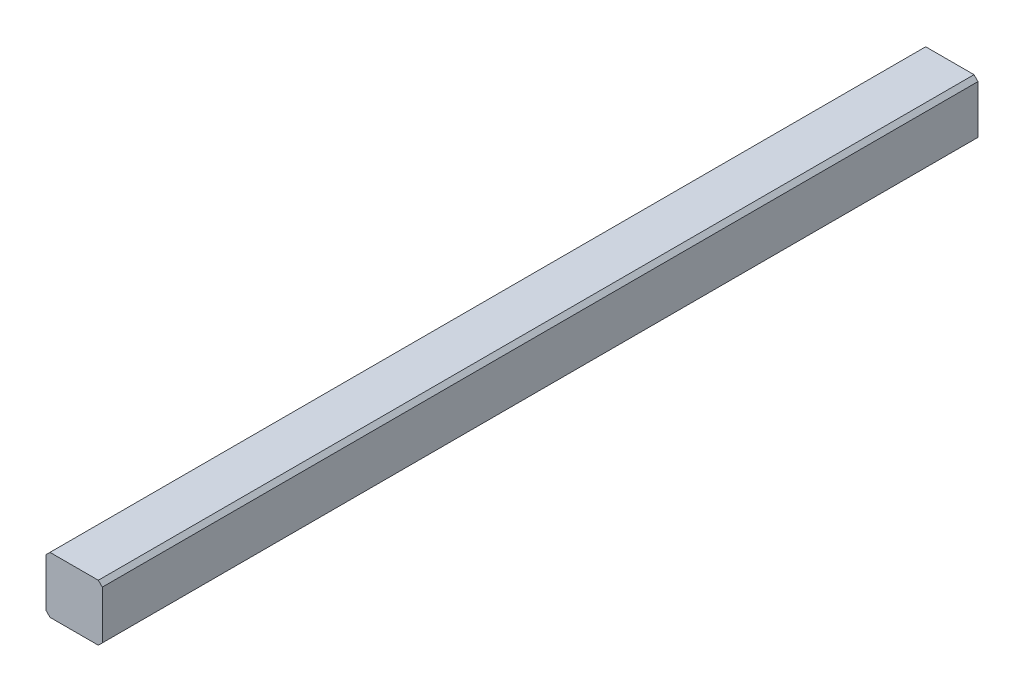
ISO-10303-21;
HEADER;
FILE_DESCRIPTION(('STEP AP214'),'2;1');
FILE_NAME('part.step','',(''),(''),'','','');
FILE_SCHEMA(('AUTOMOTIVE_DESIGN { 1 0 10303 214 1 1 1 1 }'));
ENDSEC;
DATA;
#1=APPLICATION_CONTEXT('core data for automotive mechanical design processes');
#2=APPLICATION_PROTOCOL_DEFINITION('international standard','automotive_design',2000,#1);
#3=PRODUCT_CONTEXT('',#1,'mechanical');
#4=PRODUCT('Part','Part','',(#3));
#5=PRODUCT_RELATED_PRODUCT_CATEGORY('part','',(#4));
#6=PRODUCT_DEFINITION_FORMATION('','',#4);
#7=PRODUCT_DEFINITION_CONTEXT('part definition',#1,'design');
#8=PRODUCT_DEFINITION('design','',#6,#7);
#9=PRODUCT_DEFINITION_SHAPE('','',#8);
#10=(LENGTH_UNIT() NAMED_UNIT(*) SI_UNIT(.MILLI.,.METRE.));
#11=(NAMED_UNIT(*) PLANE_ANGLE_UNIT() SI_UNIT($,.RADIAN.));
#12=(NAMED_UNIT(*) SI_UNIT($,.STERADIAN.) SOLID_ANGLE_UNIT());
#13=UNCERTAINTY_MEASURE_WITH_UNIT(LENGTH_MEASURE(1.E-05),#10,'distance_accuracy_value','');
#14=(GEOMETRIC_REPRESENTATION_CONTEXT(3) GLOBAL_UNCERTAINTY_ASSIGNED_CONTEXT((#13)) GLOBAL_UNIT_ASSIGNED_CONTEXT((#10,
#11,#12)) REPRESENTATION_CONTEXT('',''));
#15=CARTESIAN_POINT('',(0.,0.,0.));
#16=DIRECTION('',(0.,0.,1.));
#17=DIRECTION('',(1.,0.,0.));
#18=AXIS2_PLACEMENT_3D('',#15,#16,#17);
#19=CARTESIAN_POINT('',(-3.53553390593274,-3.53553390593274,110.));
#20=DIRECTION('',(1.,0.,0.));
#21=DIRECTION('',(0.,0.,-1.));
#22=AXIS2_PLACEMENT_3D('',#19,#20,#21);
#23=PLANE('',#22);
#24=DIRECTION('',(0.,-1.,0.));
#25=VECTOR('',#24,1.);
#26=CARTESIAN_POINT('',(-3.53553390593274,-3.53553390593274,0.));
#27=LINE('',#26,#25);
#28=CARTESIAN_POINT('',(-3.53553390593274,3.03553390593274,0.));
#29=VERTEX_POINT('',#28);
#30=CARTESIAN_POINT('',(-3.53553390593274,-3.03553390593274,0.));
#31=VERTEX_POINT('',#30);
#32=EDGE_CURVE('E133',#29,#31,#27,.T.);
#33=ORIENTED_EDGE('',*,*,#32,.T.);
#34=DIRECTION('',(0.,0.,1.));
#35=VECTOR('',#34,1.);
#36=CARTESIAN_POINT('',(-3.53553390593274,-3.03553390593274,110.));
#37=LINE('',#36,#35);
#38=CARTESIAN_POINT('',(-3.53553390593274,-3.03553390593274,110.));
#39=VERTEX_POINT('',#38);
#40=EDGE_CURVE('E155',#31,#39,#37,.T.);
#41=ORIENTED_EDGE('',*,*,#40,.T.);
#42=DIRECTION('',(0.,-1.,0.));
#43=VECTOR('',#42,1.);
#44=CARTESIAN_POINT('',(-3.53553390593274,-3.53553390593274,110.));
#45=LINE('',#44,#43);
#46=CARTESIAN_POINT('',(-3.53553390593274,3.03553390593274,110.));
#47=VERTEX_POINT('',#46);
#48=EDGE_CURVE('E131',#47,#39,#45,.T.);
#49=ORIENTED_EDGE('',*,*,#48,.F.);
#50=DIRECTION('',(0.,0.,-1.));
#51=VECTOR('',#50,1.);
#52=CARTESIAN_POINT('',(-3.53553390593274,3.03553390593274,110.));
#53=LINE('',#52,#51);
#54=EDGE_CURVE('E152',#47,#29,#53,.T.);
#55=ORIENTED_EDGE('',*,*,#54,.T.);
#56=EDGE_LOOP('',(#33,#41,#49,#55));
#57=FACE_BOUND('',#56,.T.);
#58=ADVANCED_FACE('F35',(#57),#23,.F.);
#59=CARTESIAN_POINT('',(3.53553390593274,-3.53553390593274,110.));
#60=DIRECTION('',(0.,1.,0.));
#61=DIRECTION('',(-1.,0.,0.));
#62=AXIS2_PLACEMENT_3D('',#59,#60,#61);
#63=PLANE('',#62);
#64=DIRECTION('',(1.,0.,0.));
#65=VECTOR('',#64,1.);
#66=CARTESIAN_POINT('',(3.53553390593274,-3.53553390593274,0.));
#67=LINE('',#66,#65);
#68=CARTESIAN_POINT('',(-3.03553390593274,-3.53553390593274,0.));
#69=VERTEX_POINT('',#68);
#70=CARTESIAN_POINT('',(3.03553390593274,-3.53553390593274,0.));
#71=VERTEX_POINT('',#70);
#72=EDGE_CURVE('E129',#69,#71,#67,.T.);
#73=ORIENTED_EDGE('',*,*,#72,.T.);
#74=DIRECTION('',(0.,0.,1.));
#75=VECTOR('',#74,1.);
#76=CARTESIAN_POINT('',(3.03553390593274,-3.53553390593274,110.));
#77=LINE('',#76,#75);
#78=CARTESIAN_POINT('',(3.03553390593274,-3.53553390593274,110.));
#79=VERTEX_POINT('',#78);
#80=EDGE_CURVE('E107',#71,#79,#77,.T.);
#81=ORIENTED_EDGE('',*,*,#80,.T.);
#82=DIRECTION('',(1.,0.,0.));
#83=VECTOR('',#82,1.);
#84=CARTESIAN_POINT('',(3.53553390593274,-3.53553390593274,110.));
#85=LINE('',#84,#83);
#86=CARTESIAN_POINT('',(-3.03553390593274,-3.53553390593274,110.));
#87=VERTEX_POINT('',#86);
#88=EDGE_CURVE('E169',#87,#79,#85,.T.);
#89=ORIENTED_EDGE('',*,*,#88,.F.);
#90=DIRECTION('',(0.,0.,-1.));
#91=VECTOR('',#90,1.);
#92=CARTESIAN_POINT('',(-3.03553390593274,-3.53553390593274,110.));
#93=LINE('',#92,#91);
#94=EDGE_CURVE('E112',#87,#69,#93,.T.);
#95=ORIENTED_EDGE('',*,*,#94,.T.);
#96=EDGE_LOOP('',(#73,#81,#89,#95));
#97=FACE_BOUND('',#96,.T.);
#98=ADVANCED_FACE('F174',(#97),#63,.F.);
#99=CARTESIAN_POINT('',(3.53553390593274,-3.53553390593274,110.));
#100=DIRECTION('',(-1.,0.,0.));
#101=DIRECTION('',(0.,-1.,0.));
#102=AXIS2_PLACEMENT_3D('',#99,#100,#101);
#103=PLANE('',#102);
#104=DIRECTION('',(0.,1.,0.));
#105=VECTOR('',#104,1.);
#106=CARTESIAN_POINT('',(3.53553390593274,-3.53553390593274,110.));
#107=LINE('',#106,#105);
#108=CARTESIAN_POINT('',(3.53553390593274,-3.03553390593274,110.));
#109=VERTEX_POINT('',#108);
#110=CARTESIAN_POINT('',(3.53553390593274,3.03553390593274,110.));
#111=VERTEX_POINT('',#110);
#112=EDGE_CURVE('E121',#109,#111,#107,.T.);
#113=ORIENTED_EDGE('',*,*,#112,.F.);
#114=DIRECTION('',(0.,0.,-1.));
#115=VECTOR('',#114,1.);
#116=CARTESIAN_POINT('',(3.53553390593274,-3.03553390593274,110.));
#117=LINE('',#116,#115);
#118=CARTESIAN_POINT('',(3.53553390593274,-3.03553390593274,0.));
#119=VERTEX_POINT('',#118);
#120=EDGE_CURVE('E106',#109,#119,#117,.T.);
#121=ORIENTED_EDGE('',*,*,#120,.T.);
#122=DIRECTION('',(0.,1.,0.));
#123=VECTOR('',#122,1.);
#124=CARTESIAN_POINT('',(3.53553390593274,-3.53553390593274,0.));
#125=LINE('',#124,#123);
#126=CARTESIAN_POINT('',(3.53553390593274,3.03553390593274,0.));
#127=VERTEX_POINT('',#126);
#128=EDGE_CURVE('E119',#119,#127,#125,.T.);
#129=ORIENTED_EDGE('',*,*,#128,.T.);
#130=DIRECTION('',(0.,0.,1.));
#131=VECTOR('',#130,1.);
#132=CARTESIAN_POINT('',(3.53553390593274,3.03553390593274,110.));
#133=LINE('',#132,#131);
#134=EDGE_CURVE('E123',#127,#111,#133,.T.);
#135=ORIENTED_EDGE('',*,*,#134,.T.);
#136=EDGE_LOOP('',(#113,#121,#129,#135));
#137=FACE_BOUND('',#136,.T.);
#138=ADVANCED_FACE('F118',(#137),#103,.F.);
#139=CARTESIAN_POINT('',(3.53553390593274,3.53553390593274,110.));
#140=DIRECTION('',(0.,-1.,0.));
#141=DIRECTION('',(1.,0.,0.));
#142=AXIS2_PLACEMENT_3D('',#139,#140,#141);
#143=PLANE('',#142);
#144=DIRECTION('',(-1.,0.,0.));
#145=VECTOR('',#144,1.);
#146=CARTESIAN_POINT('',(3.53553390593274,3.53553390593274,110.));
#147=LINE('',#146,#145);
#148=CARTESIAN_POINT('',(3.03553390593274,3.53553390593274,110.));
#149=VERTEX_POINT('',#148);
#150=CARTESIAN_POINT('',(-3.03553390593274,3.53553390593274,110.));
#151=VERTEX_POINT('',#150);
#152=EDGE_CURVE('E137',#149,#151,#147,.T.);
#153=ORIENTED_EDGE('',*,*,#152,.F.);
#154=DIRECTION('',(0.,0.,-1.));
#155=VECTOR('',#154,1.);
#156=CARTESIAN_POINT('',(3.03553390593274,3.53553390593274,110.));
#157=LINE('',#156,#155);
#158=CARTESIAN_POINT('',(3.03553390593274,3.53553390593274,0.));
#159=VERTEX_POINT('',#158);
#160=EDGE_CURVE('E11',#149,#159,#157,.T.);
#161=ORIENTED_EDGE('',*,*,#160,.T.);
#162=DIRECTION('',(-1.,0.,0.));
#163=VECTOR('',#162,1.);
#164=CARTESIAN_POINT('',(3.53553390593274,3.53553390593274,0.));
#165=LINE('',#164,#163);
#166=CARTESIAN_POINT('',(-3.03553390593274,3.53553390593274,0.));
#167=VERTEX_POINT('',#166);
#168=EDGE_CURVE('E128',#159,#167,#165,.T.);
#169=ORIENTED_EDGE('',*,*,#168,.T.);
#170=DIRECTION('',(0.,0.,1.));
#171=VECTOR('',#170,1.);
#172=CARTESIAN_POINT('',(-3.03553390593274,3.53553390593274,110.));
#173=LINE('',#172,#171);
#174=EDGE_CURVE('E44',#167,#151,#173,.T.);
#175=ORIENTED_EDGE('',*,*,#174,.T.);
#176=EDGE_LOOP('',(#153,#161,#169,#175));
#177=FACE_BOUND('',#176,.T.);
#178=ADVANCED_FACE('F181',(#177),#143,.F.);
#179=CARTESIAN_POINT('',(0.,0.,110.));
#180=DIRECTION('',(0.,0.,1.));
#181=DIRECTION('',(1.,0.,0.));
#182=AXIS2_PLACEMENT_3D('',#179,#180,#181);
#183=PLANE('',#182);
#184=ORIENTED_EDGE('',*,*,#88,.T.);
#185=DIRECTION('',(-0.707106781186548,-0.707106781186548,0.));
#186=VECTOR('',#185,1.);
#187=CARTESIAN_POINT('',(3.28553390593274,-3.28553390593274,110.));
#188=LINE('',#187,#186);
#189=EDGE_CURVE('E150',#79,#109,#188,.F.);
#190=ORIENTED_EDGE('',*,*,#189,.T.);
#191=ORIENTED_EDGE('',*,*,#112,.T.);
#192=DIRECTION('',(0.707106781186548,-0.707106781186548,0.));
#193=VECTOR('',#192,1.);
#194=CARTESIAN_POINT('',(3.28553390593274,3.28553390593274,110.));
#195=LINE('',#194,#193);
#196=EDGE_CURVE('E57',#111,#149,#195,.F.);
#197=ORIENTED_EDGE('',*,*,#196,.T.);
#198=ORIENTED_EDGE('',*,*,#152,.T.);
#199=DIRECTION('',(0.707106781186548,0.707106781186547,0.));
#200=VECTOR('',#199,1.);
#201=CARTESIAN_POINT('',(-3.28553390593274,3.28553390593274,110.));
#202=LINE('',#201,#200);
#203=EDGE_CURVE('E145',#151,#47,#202,.F.);
#204=ORIENTED_EDGE('',*,*,#203,.T.);
#205=ORIENTED_EDGE('',*,*,#48,.T.);
#206=DIRECTION('',(-0.707106781186548,0.707106781186548,0.));
#207=VECTOR('',#206,1.);
#208=CARTESIAN_POINT('',(-3.28553390593274,-3.28553390593274,110.));
#209=LINE('',#208,#207);
#210=EDGE_CURVE('E148',#39,#87,#209,.F.);
#211=ORIENTED_EDGE('',*,*,#210,.T.);
#212=EDGE_LOOP('',(#184,#190,#191,#197,#198,#204,#205,#211));
#213=FACE_BOUND('',#212,.T.);
#214=ADVANCED_FACE('F166',(#213),#183,.T.);
#215=CARTESIAN_POINT('',(0.,0.,0.));
#216=DIRECTION('',(0.,0.,1.));
#217=DIRECTION('',(1.,0.,0.));
#218=AXIS2_PLACEMENT_3D('',#215,#216,#217);
#219=PLANE('',#218);
#220=ORIENTED_EDGE('',*,*,#128,.F.);
#221=DIRECTION('',(0.707106781186548,0.707106781186548,0.));
#222=VECTOR('',#221,1.);
#223=CARTESIAN_POINT('',(3.53553390593274,-3.03553390593274,0.));
#224=LINE('',#223,#222);
#225=EDGE_CURVE('E102',#119,#71,#224,.F.);
#226=ORIENTED_EDGE('',*,*,#225,.T.);
#227=ORIENTED_EDGE('',*,*,#72,.F.);
#228=DIRECTION('',(0.707106781186548,-0.707106781186548,0.));
#229=VECTOR('',#228,1.);
#230=CARTESIAN_POINT('',(-3.03553390593274,-3.53553390593274,0.));
#231=LINE('',#230,#229);
#232=EDGE_CURVE('E113',#69,#31,#231,.F.);
#233=ORIENTED_EDGE('',*,*,#232,.T.);
#234=ORIENTED_EDGE('',*,*,#32,.F.);
#235=DIRECTION('',(-0.707106781186548,-0.707106781186547,0.));
#236=VECTOR('',#235,1.);
#237=CARTESIAN_POINT('',(-3.53553390593274,3.03553390593274,0.));
#238=LINE('',#237,#236);
#239=EDGE_CURVE('E122',#29,#167,#238,.F.);
#240=ORIENTED_EDGE('',*,*,#239,.T.);
#241=ORIENTED_EDGE('',*,*,#168,.F.);
#242=DIRECTION('',(-0.707106781186548,0.707106781186548,0.));
#243=VECTOR('',#242,1.);
#244=CARTESIAN_POINT('',(3.03553390593274,3.53553390593274,0.));
#245=LINE('',#244,#243);
#246=EDGE_CURVE('E127',#159,#127,#245,.F.);
#247=ORIENTED_EDGE('',*,*,#246,.T.);
#248=EDGE_LOOP('',(#220,#226,#227,#233,#234,#240,#241,#247));
#249=FACE_BOUND('',#248,.T.);
#250=ADVANCED_FACE('F125',(#249),#219,.F.);
#251=CARTESIAN_POINT('',(3.53553390593274,-3.03553390593274,110.));
#252=DIRECTION('',(-0.707106781186547,0.707106781186547,0.));
#253=DIRECTION('',(0.,0.,-1.));
#254=AXIS2_PLACEMENT_3D('',#251,#252,#253);
#255=PLANE('',#254);
#256=ORIENTED_EDGE('',*,*,#189,.F.);
#257=ORIENTED_EDGE('',*,*,#80,.F.);
#258=ORIENTED_EDGE('',*,*,#225,.F.);
#259=ORIENTED_EDGE('',*,*,#120,.F.);
#260=EDGE_LOOP('',(#256,#257,#258,#259));
#261=FACE_BOUND('',#260,.T.);
#262=ADVANCED_FACE('F105',(#261),#255,.F.);
#263=CARTESIAN_POINT('',(-3.03553390593274,-3.53553390593274,110.));
#264=DIRECTION('',(0.707106781186547,0.707106781186547,0.));
#265=DIRECTION('',(0.,0.,-1.));
#266=AXIS2_PLACEMENT_3D('',#263,#264,#265);
#267=PLANE('',#266);
#268=ORIENTED_EDGE('',*,*,#210,.F.);
#269=ORIENTED_EDGE('',*,*,#40,.F.);
#270=ORIENTED_EDGE('',*,*,#232,.F.);
#271=ORIENTED_EDGE('',*,*,#94,.F.);
#272=EDGE_LOOP('',(#268,#269,#270,#271));
#273=FACE_BOUND('',#272,.T.);
#274=ADVANCED_FACE('F172',(#273),#267,.F.);
#275=CARTESIAN_POINT('',(3.03553390593274,3.53553390593274,110.));
#276=DIRECTION('',(-0.707106781186547,-0.707106781186547,0.));
#277=DIRECTION('',(0.,0.,-1.));
#278=AXIS2_PLACEMENT_3D('',#275,#276,#277);
#279=PLANE('',#278);
#280=ORIENTED_EDGE('',*,*,#196,.F.);
#281=ORIENTED_EDGE('',*,*,#134,.F.);
#282=ORIENTED_EDGE('',*,*,#246,.F.);
#283=ORIENTED_EDGE('',*,*,#160,.F.);
#284=EDGE_LOOP('',(#280,#281,#282,#283));
#285=FACE_BOUND('',#284,.T.);
#286=ADVANCED_FACE('F180',(#285),#279,.F.);
#287=CARTESIAN_POINT('',(-3.53553390593274,3.03553390593274,110.));
#288=DIRECTION('',(0.707106781186547,-0.707106781186548,0.));
#289=DIRECTION('',(0.,0.,-1.));
#290=AXIS2_PLACEMENT_3D('',#287,#288,#289);
#291=PLANE('',#290);
#292=ORIENTED_EDGE('',*,*,#203,.F.);
#293=ORIENTED_EDGE('',*,*,#174,.F.);
#294=ORIENTED_EDGE('',*,*,#239,.F.);
#295=ORIENTED_EDGE('',*,*,#54,.F.);
#296=EDGE_LOOP('',(#292,#293,#294,#295));
#297=FACE_BOUND('',#296,.T.);
#298=ADVANCED_FACE('F38',(#297),#291,.F.);
#299=CLOSED_SHELL('',(#58,#98,#138,#178,#214,#250,#262,#274,#286,#298));
#300=MANIFOLD_SOLID_BREP('B2',#299);
#301=ADVANCED_BREP_SHAPE_REPRESENTATION('',(#18,#300),#14);
#302=SHAPE_DEFINITION_REPRESENTATION(#9,#301);
ENDSEC;
END-ISO-10303-21;
